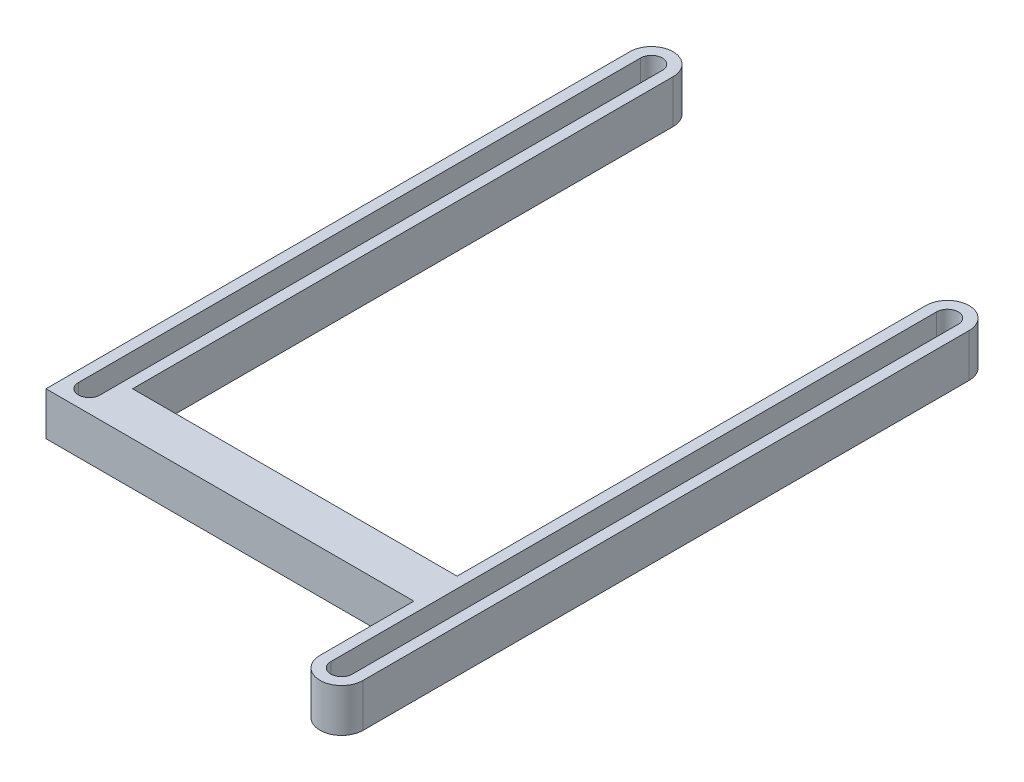
ISO-10303-21;
HEADER;
FILE_DESCRIPTION(('STEP AP214'),'2;1');
FILE_NAME('part.step','',(''),(''),'','','');
FILE_SCHEMA(('AUTOMOTIVE_DESIGN { 1 0 10303 214 1 1 1 1 }'));
ENDSEC;
DATA;
#1=APPLICATION_CONTEXT('core data for automotive mechanical design processes');
#2=APPLICATION_PROTOCOL_DEFINITION('international standard','automotive_design',2000,#1);
#3=PRODUCT_CONTEXT('',#1,'mechanical');
#4=PRODUCT('Part','Part','',(#3));
#5=PRODUCT_RELATED_PRODUCT_CATEGORY('part','',(#4));
#6=PRODUCT_DEFINITION_FORMATION('','',#4);
#7=PRODUCT_DEFINITION_CONTEXT('part definition',#1,'design');
#8=PRODUCT_DEFINITION('design','',#6,#7);
#9=PRODUCT_DEFINITION_SHAPE('','',#8);
#10=(LENGTH_UNIT() NAMED_UNIT(*) SI_UNIT(.MILLI.,.METRE.));
#11=(NAMED_UNIT(*) PLANE_ANGLE_UNIT() SI_UNIT($,.RADIAN.));
#12=(NAMED_UNIT(*) SI_UNIT($,.STERADIAN.) SOLID_ANGLE_UNIT());
#13=UNCERTAINTY_MEASURE_WITH_UNIT(LENGTH_MEASURE(1.E-05),#10,'distance_accuracy_value','');
#14=(GEOMETRIC_REPRESENTATION_CONTEXT(3) GLOBAL_UNCERTAINTY_ASSIGNED_CONTEXT((#13)) GLOBAL_UNIT_ASSIGNED_CONTEXT((#10,
#11,#12)) REPRESENTATION_CONTEXT('',''));
#15=CARTESIAN_POINT('',(0.,0.,0.));
#16=DIRECTION('',(0.,0.,1.));
#17=DIRECTION('',(1.,0.,0.));
#18=AXIS2_PLACEMENT_3D('',#15,#16,#17);
#19=CARTESIAN_POINT('',(245.,-20.,0.));
#20=DIRECTION('',(1.,0.,0.));
#21=DIRECTION('',(0.,0.,-1.));
#22=AXIS2_PLACEMENT_3D('',#19,#20,#21);
#23=PLANE('',#22);
#24=DIRECTION('',(0.,0.,-1.));
#25=VECTOR('',#24,1.);
#26=CARTESIAN_POINT('',(245.,-10.,0.));
#27=LINE('',#26,#25);
#28=CARTESIAN_POINT('',(245.,-10.,567.916512459885));
#29=VERTEX_POINT('',#28);
#30=CARTESIAN_POINT('',(245.,-10.,433.01270189222));
#31=VERTEX_POINT('',#30);
#32=EDGE_CURVE('E221',#29,#31,#27,.T.);
#33=ORIENTED_EDGE('',*,*,#32,.T.);
#34=DIRECTION('',(0.,1.,0.));
#35=VECTOR('',#34,1.);
#36=CARTESIAN_POINT('',(245.,-20.,433.01270189222));
#37=LINE('',#36,#35);
#38=CARTESIAN_POINT('',(245.,-20.,433.01270189222));
#39=VERTEX_POINT('',#38);
#40=EDGE_CURVE('E11',#39,#31,#37,.T.);
#41=ORIENTED_EDGE('',*,*,#40,.F.);
#42=DIRECTION('',(0.,0.,-1.));
#43=VECTOR('',#42,1.);
#44=CARTESIAN_POINT('',(245.,-20.,0.));
#45=LINE('',#44,#43);
#46=CARTESIAN_POINT('',(245.,-20.,567.916512459885));
#47=VERTEX_POINT('',#46);
#48=EDGE_CURVE('E385',#47,#39,#45,.T.);
#49=ORIENTED_EDGE('',*,*,#48,.F.);
#50=DIRECTION('',(0.,1.,0.));
#51=VECTOR('',#50,1.);
#52=CARTESIAN_POINT('',(245.,-20.,567.916512459885));
#53=LINE('',#52,#51);
#54=EDGE_CURVE('E245',#47,#29,#53,.T.);
#55=ORIENTED_EDGE('',*,*,#54,.T.);
#56=EDGE_LOOP('',(#33,#41,#49,#55));
#57=FACE_BOUND('',#56,.T.);
#58=ADVANCED_FACE('F35',(#57),#23,.F.);
#59=CARTESIAN_POINT('',(250.,-20.,433.01270189222));
#60=DIRECTION('',(0.,1.,0.));
#61=DIRECTION('',(0.,0.,1.));
#62=AXIS2_PLACEMENT_3D('',#59,#60,#61);
#63=CYLINDRICAL_SURFACE('',#62,5.);
#64=CARTESIAN_POINT('',(250.,-10.,433.01270189222));
#65=DIRECTION('',(0.,-1.,0.));
#66=DIRECTION('',(0.,0.,-1.));
#67=AXIS2_PLACEMENT_3D('',#64,#65,#66);
#68=CIRCLE('',#67,5.);
#69=CARTESIAN_POINT('',(255.,-10.,433.01270189222));
#70=VERTEX_POINT('',#69);
#71=EDGE_CURVE('E224',#31,#70,#68,.T.);
#72=ORIENTED_EDGE('',*,*,#71,.T.);
#73=DIRECTION('',(0.,1.,0.));
#74=VECTOR('',#73,1.);
#75=CARTESIAN_POINT('',(255.,-20.,433.01270189222));
#76=LINE('',#75,#74);
#77=CARTESIAN_POINT('',(255.,-20.,433.01270189222));
#78=VERTEX_POINT('',#77);
#79=EDGE_CURVE('E45',#78,#70,#76,.T.);
#80=ORIENTED_EDGE('',*,*,#79,.F.);
#81=CARTESIAN_POINT('',(250.,-20.,433.01270189222));
#82=DIRECTION('',(0.,-1.,0.));
#83=DIRECTION('',(0.,0.,-1.));
#84=AXIS2_PLACEMENT_3D('',#81,#82,#83);
#85=CIRCLE('',#84,5.);
#86=EDGE_CURVE('E376',#39,#78,#85,.T.);
#87=ORIENTED_EDGE('',*,*,#86,.F.);
#88=ORIENTED_EDGE('',*,*,#40,.T.);
#89=EDGE_LOOP('',(#72,#80,#87,#88));
#90=FACE_BOUND('',#89,.T.);
#91=ADVANCED_FACE('F301',(#90),#63,.T.);
#92=CARTESIAN_POINT('',(255.,-20.,0.));
#93=DIRECTION('',(1.,0.,0.));
#94=DIRECTION('',(0.,0.,-1.));
#95=AXIS2_PLACEMENT_3D('',#92,#93,#94);
#96=PLANE('',#95);
#97=DIRECTION('',(0.,0.,-1.));
#98=VECTOR('',#97,1.);
#99=CARTESIAN_POINT('',(255.,-10.,0.));
#100=LINE('',#99,#98);
#101=CARTESIAN_POINT('',(255.,-10.,557.916512459885));
#102=VERTEX_POINT('',#101);
#103=EDGE_CURVE('E227',#102,#70,#100,.T.);
#104=ORIENTED_EDGE('',*,*,#103,.F.);
#105=DIRECTION('',(0.,1.,0.));
#106=VECTOR('',#105,1.);
#107=CARTESIAN_POINT('',(255.,-20.,557.916512459885));
#108=LINE('',#107,#106);
#109=CARTESIAN_POINT('',(255.,-20.,557.916512459885));
#110=VERTEX_POINT('',#109);
#111=EDGE_CURVE('E257',#110,#102,#108,.T.);
#112=ORIENTED_EDGE('',*,*,#111,.F.);
#113=DIRECTION('',(0.,0.,-1.));
#114=VECTOR('',#113,1.);
#115=CARTESIAN_POINT('',(255.,-20.,0.));
#116=LINE('',#115,#114);
#117=EDGE_CURVE('E373',#110,#78,#116,.T.);
#118=ORIENTED_EDGE('',*,*,#117,.T.);
#119=ORIENTED_EDGE('',*,*,#79,.T.);
#120=EDGE_LOOP('',(#104,#112,#118,#119));
#121=FACE_BOUND('',#120,.T.);
#122=ADVANCED_FACE('F307',(#121),#96,.T.);
#123=CARTESIAN_POINT('',(0.,-20.,557.916512459885));
#124=DIRECTION('',(0.,0.,-1.));
#125=DIRECTION('',(-1.,0.,0.));
#126=AXIS2_PLACEMENT_3D('',#123,#124,#125);
#127=PLANE('',#126);
#128=DIRECTION('',(-1.,0.,0.));
#129=VECTOR('',#128,1.);
#130=CARTESIAN_POINT('',(0.,-10.,557.916512459885));
#131=LINE('',#130,#129);
#132=CARTESIAN_POINT('',(330.,-10.,557.916512459885));
#133=VERTEX_POINT('',#132);
#134=EDGE_CURVE('E230',#133,#102,#131,.T.);
#135=ORIENTED_EDGE('',*,*,#134,.F.);
#136=DIRECTION('',(0.,1.,0.));
#137=VECTOR('',#136,1.);
#138=CARTESIAN_POINT('',(330.,-20.,557.916512459885));
#139=LINE('',#138,#137);
#140=CARTESIAN_POINT('',(330.,-20.,557.916512459885));
#141=VERTEX_POINT('',#140);
#142=EDGE_CURVE('E255',#141,#133,#139,.T.);
#143=ORIENTED_EDGE('',*,*,#142,.F.);
#144=DIRECTION('',(-1.,0.,0.));
#145=VECTOR('',#144,1.);
#146=CARTESIAN_POINT('',(0.,-20.,557.916512459885));
#147=LINE('',#146,#145);
#148=EDGE_CURVE('E371',#141,#110,#147,.T.);
#149=ORIENTED_EDGE('',*,*,#148,.T.);
#150=ORIENTED_EDGE('',*,*,#111,.T.);
#151=EDGE_LOOP('',(#135,#143,#149,#150));
#152=FACE_BOUND('',#151,.T.);
#153=ADVANCED_FACE('F351',(#152),#127,.T.);
#154=CARTESIAN_POINT('',(330.,-20.,0.));
#155=DIRECTION('',(1.,0.,0.));
#156=DIRECTION('',(0.,0.,-1.));
#157=AXIS2_PLACEMENT_3D('',#154,#155,#156);
#158=PLANE('',#157);
#159=DIRECTION('',(0.,0.,-1.));
#160=VECTOR('',#159,1.);
#161=CARTESIAN_POINT('',(330.,-10.,0.));
#162=LINE('',#161,#160);
#163=CARTESIAN_POINT('',(330.,-10.,449.615242270663));
#164=VERTEX_POINT('',#163);
#165=EDGE_CURVE('E233',#133,#164,#162,.T.);
#166=ORIENTED_EDGE('',*,*,#165,.T.);
#167=DIRECTION('',(0.,1.,0.));
#168=VECTOR('',#167,1.);
#169=CARTESIAN_POINT('',(330.,-20.,449.615242270663));
#170=LINE('',#169,#168);
#171=CARTESIAN_POINT('',(330.,-20.,449.615242270663));
#172=VERTEX_POINT('',#171);
#173=EDGE_CURVE('E252',#172,#164,#170,.T.);
#174=ORIENTED_EDGE('',*,*,#173,.F.);
#175=DIRECTION('',(0.,0.,-1.));
#176=VECTOR('',#175,1.);
#177=CARTESIAN_POINT('',(330.,-20.,0.));
#178=LINE('',#177,#176);
#179=EDGE_CURVE('E372',#141,#172,#178,.T.);
#180=ORIENTED_EDGE('',*,*,#179,.F.);
#181=ORIENTED_EDGE('',*,*,#142,.T.);
#182=EDGE_LOOP('',(#166,#174,#180,#181));
#183=FACE_BOUND('',#182,.T.);
#184=ADVANCED_FACE('F347',(#183),#158,.F.);
#185=CARTESIAN_POINT('',(335.,-20.,449.615242270663));
#186=DIRECTION('',(0.,1.,0.));
#187=DIRECTION('',(0.,0.,1.));
#188=AXIS2_PLACEMENT_3D('',#185,#186,#187);
#189=CYLINDRICAL_SURFACE('',#188,5.);
#190=CARTESIAN_POINT('',(335.,-10.,449.615242270663));
#191=DIRECTION('',(0.,-1.,0.));
#192=DIRECTION('',(0.,0.,-1.));
#193=AXIS2_PLACEMENT_3D('',#190,#191,#192);
#194=CIRCLE('',#193,5.);
#195=CARTESIAN_POINT('',(340.,-10.,449.615242270663));
#196=VERTEX_POINT('',#195);
#197=EDGE_CURVE('E235',#164,#196,#194,.T.);
#198=ORIENTED_EDGE('',*,*,#197,.T.);
#199=DIRECTION('',(0.,1.,0.));
#200=VECTOR('',#199,1.);
#201=CARTESIAN_POINT('',(340.,-20.,449.615242270663));
#202=LINE('',#201,#200);
#203=CARTESIAN_POINT('',(340.,-20.,449.615242270663));
#204=VERTEX_POINT('',#203);
#205=EDGE_CURVE('E250',#204,#196,#202,.T.);
#206=ORIENTED_EDGE('',*,*,#205,.F.);
#207=CARTESIAN_POINT('',(335.,-20.,449.615242270663));
#208=DIRECTION('',(0.,-1.,0.));
#209=DIRECTION('',(0.,0.,-1.));
#210=AXIS2_PLACEMENT_3D('',#207,#208,#209);
#211=CIRCLE('',#210,5.);
#212=EDGE_CURVE('E191',#172,#204,#211,.T.);
#213=ORIENTED_EDGE('',*,*,#212,.F.);
#214=ORIENTED_EDGE('',*,*,#173,.T.);
#215=EDGE_LOOP('',(#198,#206,#213,#214));
#216=FACE_BOUND('',#215,.T.);
#217=ADVANCED_FACE('F343',(#216),#189,.T.);
#218=CARTESIAN_POINT('',(340.,-20.,0.));
#219=DIRECTION('',(1.,0.,0.));
#220=DIRECTION('',(0.,0.,-1.));
#221=AXIS2_PLACEMENT_3D('',#218,#219,#220);
#222=PLANE('',#221);
#223=DIRECTION('',(0.,0.,-1.));
#224=VECTOR('',#223,1.);
#225=CARTESIAN_POINT('',(340.,-10.,0.));
#226=LINE('',#225,#224);
#227=CARTESIAN_POINT('',(340.,-10.,589.615242270663));
#228=VERTEX_POINT('',#227);
#229=EDGE_CURVE('E238',#228,#196,#226,.T.);
#230=ORIENTED_EDGE('',*,*,#229,.F.);
#231=DIRECTION('',(0.,1.,0.));
#232=VECTOR('',#231,1.);
#233=CARTESIAN_POINT('',(340.,-20.,589.615242270663));
#234=LINE('',#233,#232);
#235=CARTESIAN_POINT('',(340.,-20.,589.615242270663));
#236=VERTEX_POINT('',#235);
#237=EDGE_CURVE('E180',#236,#228,#234,.T.);
#238=ORIENTED_EDGE('',*,*,#237,.F.);
#239=DIRECTION('',(0.,0.,-1.));
#240=VECTOR('',#239,1.);
#241=CARTESIAN_POINT('',(340.,-20.,0.));
#242=LINE('',#241,#240);
#243=EDGE_CURVE('E189',#236,#204,#242,.T.);
#244=ORIENTED_EDGE('',*,*,#243,.T.);
#245=ORIENTED_EDGE('',*,*,#205,.T.);
#246=EDGE_LOOP('',(#230,#238,#244,#245));
#247=FACE_BOUND('',#246,.T.);
#248=ADVANCED_FACE('F340',(#247),#222,.T.);
#249=CARTESIAN_POINT('',(335.,-20.,589.615242270663));
#250=DIRECTION('',(0.,1.,0.));
#251=DIRECTION('',(0.,0.,1.));
#252=AXIS2_PLACEMENT_3D('',#249,#250,#251);
#253=CYLINDRICAL_SURFACE('',#252,5.);
#254=CARTESIAN_POINT('',(335.,-10.,589.615242270663));
#255=DIRECTION('',(0.,-1.,0.));
#256=DIRECTION('',(0.,0.,-1.));
#257=AXIS2_PLACEMENT_3D('',#254,#255,#256);
#258=CIRCLE('',#257,5.);
#259=CARTESIAN_POINT('',(330.,-10.,589.615242270663));
#260=VERTEX_POINT('',#259);
#261=EDGE_CURVE('E179',#260,#228,#258,.F.);
#262=ORIENTED_EDGE('',*,*,#261,.F.);
#263=DIRECTION('',(0.,1.,0.));
#264=VECTOR('',#263,1.);
#265=CARTESIAN_POINT('',(330.,-20.,589.615242270663));
#266=LINE('',#265,#264);
#267=CARTESIAN_POINT('',(330.,-20.,589.615242270663));
#268=VERTEX_POINT('',#267);
#269=EDGE_CURVE('E173',#268,#260,#266,.T.);
#270=ORIENTED_EDGE('',*,*,#269,.F.);
#271=CARTESIAN_POINT('',(335.,-20.,589.615242270663));
#272=DIRECTION('',(0.,-1.,0.));
#273=DIRECTION('',(0.,0.,-1.));
#274=AXIS2_PLACEMENT_3D('',#271,#272,#273);
#275=CIRCLE('',#274,5.);
#276=EDGE_CURVE('E177',#268,#236,#275,.F.);
#277=ORIENTED_EDGE('',*,*,#276,.T.);
#278=ORIENTED_EDGE('',*,*,#237,.T.);
#279=EDGE_LOOP('',(#262,#270,#277,#278));
#280=FACE_BOUND('',#279,.T.);
#281=ADVANCED_FACE('F175',(#280),#253,.T.);
#282=CARTESIAN_POINT('',(330.,-20.,0.));
#283=DIRECTION('',(1.,0.,0.));
#284=DIRECTION('',(0.,0.,-1.));
#285=AXIS2_PLACEMENT_3D('',#282,#283,#284);
#286=PLANE('',#285);
#287=DIRECTION('',(0.,0.,-1.));
#288=VECTOR('',#287,1.);
#289=CARTESIAN_POINT('',(330.,-10.,0.));
#290=LINE('',#289,#288);
#291=CARTESIAN_POINT('',(330.,-10.,567.916512459885));
#292=VERTEX_POINT('',#291);
#293=EDGE_CURVE('E112',#260,#292,#290,.T.);
#294=ORIENTED_EDGE('',*,*,#293,.T.);
#295=DIRECTION('',(0.,1.,0.));
#296=VECTOR('',#295,1.);
#297=CARTESIAN_POINT('',(330.,-20.,567.916512459885));
#298=LINE('',#297,#296);
#299=CARTESIAN_POINT('',(330.,-20.,567.916512459885));
#300=VERTEX_POINT('',#299);
#301=EDGE_CURVE('E181',#300,#292,#298,.T.);
#302=ORIENTED_EDGE('',*,*,#301,.F.);
#303=DIRECTION('',(0.,0.,-1.));
#304=VECTOR('',#303,1.);
#305=CARTESIAN_POINT('',(330.,-20.,0.));
#306=LINE('',#305,#304);
#307=EDGE_CURVE('E183',#268,#300,#306,.T.);
#308=ORIENTED_EDGE('',*,*,#307,.F.);
#309=ORIENTED_EDGE('',*,*,#269,.T.);
#310=EDGE_LOOP('',(#294,#302,#308,#309));
#311=FACE_BOUND('',#310,.T.);
#312=ADVANCED_FACE('F184',(#311),#286,.F.);
#313=CARTESIAN_POINT('',(250.,-20.,433.01270189222));
#314=DIRECTION('',(0.,1.,0.));
#315=DIRECTION('',(0.,0.,1.));
#316=AXIS2_PLACEMENT_3D('',#313,#314,#315);
#317=CYLINDRICAL_SURFACE('',#316,2.5);
#318=CARTESIAN_POINT('',(250.,-10.,433.01270189222));
#319=DIRECTION('',(0.,-1.,0.));
#320=DIRECTION('',(0.,0.,-1.));
#321=AXIS2_PLACEMENT_3D('',#318,#319,#320);
#322=CIRCLE('',#321,2.5);
#323=CARTESIAN_POINT('',(247.5,-10.,433.01270189222));
#324=VERTEX_POINT('',#323);
#325=CARTESIAN_POINT('',(252.5,-10.,433.01270189222));
#326=VERTEX_POINT('',#325);
#327=EDGE_CURVE('E209',#324,#326,#322,.T.);
#328=ORIENTED_EDGE('',*,*,#327,.F.);
#329=DIRECTION('',(0.,1.,0.));
#330=VECTOR('',#329,1.);
#331=CARTESIAN_POINT('',(247.5,-20.,433.01270189222));
#332=LINE('',#331,#330);
#333=CARTESIAN_POINT('',(247.5,-20.,433.01270189222));
#334=VERTEX_POINT('',#333);
#335=EDGE_CURVE('E247',#334,#324,#332,.T.);
#336=ORIENTED_EDGE('',*,*,#335,.F.);
#337=CARTESIAN_POINT('',(250.,-20.,433.01270189222));
#338=DIRECTION('',(0.,-1.,0.));
#339=DIRECTION('',(0.,0.,-1.));
#340=AXIS2_PLACEMENT_3D('',#337,#338,#339);
#341=CIRCLE('',#340,2.5);
#342=CARTESIAN_POINT('',(252.5,-20.,433.01270189222));
#343=VERTEX_POINT('',#342);
#344=EDGE_CURVE('E396',#334,#343,#341,.T.);
#345=ORIENTED_EDGE('',*,*,#344,.T.);
#346=DIRECTION('',(0.,1.,0.));
#347=VECTOR('',#346,1.);
#348=CARTESIAN_POINT('',(252.5,-20.,433.01270189222));
#349=LINE('',#348,#347);
#350=EDGE_CURVE('E260',#343,#326,#349,.T.);
#351=ORIENTED_EDGE('',*,*,#350,.T.);
#352=EDGE_LOOP('',(#328,#336,#345,#351));
#353=FACE_BOUND('',#352,.T.);
#354=ADVANCED_FACE('F319',(#353),#317,.F.);
#355=CARTESIAN_POINT('',(247.5,-20.,0.));
#356=DIRECTION('',(1.,0.,0.));
#357=DIRECTION('',(0.,0.,-1.));
#358=AXIS2_PLACEMENT_3D('',#355,#356,#357);
#359=PLANE('',#358);
#360=DIRECTION('',(0.,0.,-1.));
#361=VECTOR('',#360,1.);
#362=CARTESIAN_POINT('',(247.5,-10.,0.));
#363=LINE('',#362,#361);
#364=CARTESIAN_POINT('',(247.5,-10.,562.916512459885));
#365=VERTEX_POINT('',#364);
#366=EDGE_CURVE('E212',#365,#324,#363,.T.);
#367=ORIENTED_EDGE('',*,*,#366,.F.);
#368=DIRECTION('',(0.,1.,0.));
#369=VECTOR('',#368,1.);
#370=CARTESIAN_POINT('',(247.5,-20.,562.916512459885));
#371=LINE('',#370,#369);
#372=CARTESIAN_POINT('',(247.5,-20.,562.916512459885));
#373=VERTEX_POINT('',#372);
#374=EDGE_CURVE('E265',#373,#365,#371,.T.);
#375=ORIENTED_EDGE('',*,*,#374,.F.);
#376=DIRECTION('',(0.,0.,-1.));
#377=VECTOR('',#376,1.);
#378=CARTESIAN_POINT('',(247.5,-20.,0.));
#379=LINE('',#378,#377);
#380=EDGE_CURVE('E393',#373,#334,#379,.T.);
#381=ORIENTED_EDGE('',*,*,#380,.T.);
#382=ORIENTED_EDGE('',*,*,#335,.T.);
#383=EDGE_LOOP('',(#367,#375,#381,#382));
#384=FACE_BOUND('',#383,.T.);
#385=ADVANCED_FACE('F315',(#384),#359,.T.);
#386=CARTESIAN_POINT('',(250.,-20.,562.916512459885));
#387=DIRECTION('',(0.,1.,0.));
#388=DIRECTION('',(0.,0.,1.));
#389=AXIS2_PLACEMENT_3D('',#386,#387,#388);
#390=CYLINDRICAL_SURFACE('',#389,2.5);
#391=CARTESIAN_POINT('',(250.,-10.,562.916512459885));
#392=DIRECTION('',(0.,-1.,0.));
#393=DIRECTION('',(0.,0.,-1.));
#394=AXIS2_PLACEMENT_3D('',#391,#392,#393);
#395=CIRCLE('',#394,2.5);
#396=CARTESIAN_POINT('',(252.5,-10.,562.916512459885));
#397=VERTEX_POINT('',#396);
#398=EDGE_CURVE('E215',#365,#397,#395,.F.);
#399=ORIENTED_EDGE('',*,*,#398,.T.);
#400=DIRECTION('',(0.,1.,0.));
#401=VECTOR('',#400,1.);
#402=CARTESIAN_POINT('',(252.5,-20.,562.916512459885));
#403=LINE('',#402,#401);
#404=CARTESIAN_POINT('',(252.5,-20.,562.916512459885));
#405=VERTEX_POINT('',#404);
#406=EDGE_CURVE('E262',#405,#397,#403,.T.);
#407=ORIENTED_EDGE('',*,*,#406,.F.);
#408=CARTESIAN_POINT('',(250.,-20.,562.916512459885));
#409=DIRECTION('',(0.,-1.,0.));
#410=DIRECTION('',(0.,0.,-1.));
#411=AXIS2_PLACEMENT_3D('',#408,#409,#410);
#412=CIRCLE('',#411,2.5);
#413=EDGE_CURVE('E388',#373,#405,#412,.F.);
#414=ORIENTED_EDGE('',*,*,#413,.F.);
#415=ORIENTED_EDGE('',*,*,#374,.T.);
#416=EDGE_LOOP('',(#399,#407,#414,#415));
#417=FACE_BOUND('',#416,.T.);
#418=ADVANCED_FACE('F312',(#417),#390,.F.);
#419=CARTESIAN_POINT('',(335.,-20.,589.615242270663));
#420=DIRECTION('',(0.,1.,0.));
#421=DIRECTION('',(0.,0.,1.));
#422=AXIS2_PLACEMENT_3D('',#419,#420,#421);
#423=CYLINDRICAL_SURFACE('',#422,2.49999999999995);
#424=CARTESIAN_POINT('',(335.,-10.,589.615242270663));
#425=DIRECTION('',(0.,-1.,0.));
#426=DIRECTION('',(0.,0.,-1.));
#427=AXIS2_PLACEMENT_3D('',#424,#425,#426);
#428=CIRCLE('',#427,2.49999999999995);
#429=CARTESIAN_POINT('',(332.5,-10.,589.615242270663));
#430=VERTEX_POINT('',#429);
#431=CARTESIAN_POINT('',(337.5,-10.,589.615242270663));
#432=VERTEX_POINT('',#431);
#433=EDGE_CURVE('E197',#430,#432,#428,.F.);
#434=ORIENTED_EDGE('',*,*,#433,.T.);
#435=DIRECTION('',(0.,1.,0.));
#436=VECTOR('',#435,1.);
#437=CARTESIAN_POINT('',(337.5,-20.,589.615242270663));
#438=LINE('',#437,#436);
#439=CARTESIAN_POINT('',(337.5,-20.,589.615242270663));
#440=VERTEX_POINT('',#439);
#441=EDGE_CURVE('E39',#440,#432,#438,.T.);
#442=ORIENTED_EDGE('',*,*,#441,.F.);
#443=CARTESIAN_POINT('',(335.,-20.,589.615242270663));
#444=DIRECTION('',(0.,-1.,0.));
#445=DIRECTION('',(0.,0.,-1.));
#446=AXIS2_PLACEMENT_3D('',#443,#444,#445);
#447=CIRCLE('',#446,2.49999999999995);
#448=CARTESIAN_POINT('',(332.5,-20.,589.615242270663));
#449=VERTEX_POINT('',#448);
#450=EDGE_CURVE('E244',#449,#440,#447,.F.);
#451=ORIENTED_EDGE('',*,*,#450,.F.);
#452=DIRECTION('',(0.,1.,0.));
#453=VECTOR('',#452,1.);
#454=CARTESIAN_POINT('',(332.5,-20.,589.615242270663));
#455=LINE('',#454,#453);
#456=EDGE_CURVE('E196',#449,#430,#455,.T.);
#457=ORIENTED_EDGE('',*,*,#456,.T.);
#458=EDGE_LOOP('',(#434,#442,#451,#457));
#459=FACE_BOUND('',#458,.T.);
#460=ADVANCED_FACE('F37',(#459),#423,.F.);
#461=CARTESIAN_POINT('',(337.5,-20.,0.));
#462=DIRECTION('',(1.,0.,0.));
#463=DIRECTION('',(0.,0.,-1.));
#464=AXIS2_PLACEMENT_3D('',#461,#462,#463);
#465=PLANE('',#464);
#466=DIRECTION('',(0.,0.,-1.));
#467=VECTOR('',#466,1.);
#468=CARTESIAN_POINT('',(337.5,-10.,0.));
#469=LINE('',#468,#467);
#470=CARTESIAN_POINT('',(337.5,-10.,449.615242270663));
#471=VERTEX_POINT('',#470);
#472=EDGE_CURVE('E200',#432,#471,#469,.T.);
#473=ORIENTED_EDGE('',*,*,#472,.T.);
#474=DIRECTION('',(0.,1.,0.));
#475=VECTOR('',#474,1.);
#476=CARTESIAN_POINT('',(337.5,-20.,449.615242270663));
#477=LINE('',#476,#475);
#478=CARTESIAN_POINT('',(337.5,-20.,449.615242270663));
#479=VERTEX_POINT('',#478);
#480=EDGE_CURVE('E270',#479,#471,#477,.T.);
#481=ORIENTED_EDGE('',*,*,#480,.F.);
#482=DIRECTION('',(0.,0.,-1.));
#483=VECTOR('',#482,1.);
#484=CARTESIAN_POINT('',(337.5,-20.,0.));
#485=LINE('',#484,#483);
#486=EDGE_CURVE('E127',#440,#479,#485,.T.);
#487=ORIENTED_EDGE('',*,*,#486,.F.);
#488=ORIENTED_EDGE('',*,*,#441,.T.);
#489=EDGE_LOOP('',(#473,#481,#487,#488));
#490=FACE_BOUND('',#489,.T.);
#491=ADVANCED_FACE('F275',(#490),#465,.F.);
#492=CARTESIAN_POINT('',(335.,-20.,449.615242270663));
#493=DIRECTION('',(0.,1.,0.));
#494=DIRECTION('',(0.,0.,1.));
#495=AXIS2_PLACEMENT_3D('',#492,#493,#494);
#496=CYLINDRICAL_SURFACE('',#495,2.5);
#497=CARTESIAN_POINT('',(335.,-10.,449.615242270663));
#498=DIRECTION('',(0.,-1.,0.));
#499=DIRECTION('',(0.,0.,-1.));
#500=AXIS2_PLACEMENT_3D('',#497,#498,#499);
#501=CIRCLE('',#500,2.5);
#502=CARTESIAN_POINT('',(332.5,-10.,449.615242270663));
#503=VERTEX_POINT('',#502);
#504=EDGE_CURVE('E203',#503,#471,#501,.T.);
#505=ORIENTED_EDGE('',*,*,#504,.F.);
#506=DIRECTION('',(0.,1.,0.));
#507=VECTOR('',#506,1.);
#508=CARTESIAN_POINT('',(332.5,-20.,449.615242270663));
#509=LINE('',#508,#507);
#510=CARTESIAN_POINT('',(332.5,-20.,449.615242270663));
#511=VERTEX_POINT('',#510);
#512=EDGE_CURVE('E269',#511,#503,#509,.T.);
#513=ORIENTED_EDGE('',*,*,#512,.F.);
#514=CARTESIAN_POINT('',(335.,-20.,449.615242270663));
#515=DIRECTION('',(0.,-1.,0.));
#516=DIRECTION('',(0.,0.,-1.));
#517=AXIS2_PLACEMENT_3D('',#514,#515,#516);
#518=CIRCLE('',#517,2.5);
#519=EDGE_CURVE('E400',#511,#479,#518,.T.);
#520=ORIENTED_EDGE('',*,*,#519,.T.);
#521=ORIENTED_EDGE('',*,*,#480,.T.);
#522=EDGE_LOOP('',(#505,#513,#520,#521));
#523=FACE_BOUND('',#522,.T.);
#524=ADVANCED_FACE('F289',(#523),#496,.F.);
#525=CARTESIAN_POINT('',(252.5,-20.,0.));
#526=DIRECTION('',(1.,0.,0.));
#527=DIRECTION('',(0.,0.,-1.));
#528=AXIS2_PLACEMENT_3D('',#525,#526,#527);
#529=PLANE('',#528);
#530=DIRECTION('',(0.,0.,-1.));
#531=VECTOR('',#530,1.);
#532=CARTESIAN_POINT('',(252.5,-10.,0.));
#533=LINE('',#532,#531);
#534=EDGE_CURVE('E218',#397,#326,#533,.T.);
#535=ORIENTED_EDGE('',*,*,#534,.T.);
#536=ORIENTED_EDGE('',*,*,#350,.F.);
#537=DIRECTION('',(0.,0.,-1.));
#538=VECTOR('',#537,1.);
#539=CARTESIAN_POINT('',(252.5,-20.,0.));
#540=LINE('',#539,#538);
#541=EDGE_CURVE('E386',#405,#343,#540,.T.);
#542=ORIENTED_EDGE('',*,*,#541,.F.);
#543=ORIENTED_EDGE('',*,*,#406,.T.);
#544=EDGE_LOOP('',(#535,#536,#542,#543));
#545=FACE_BOUND('',#544,.T.);
#546=ADVANCED_FACE('F291',(#545),#529,.F.);
#547=CARTESIAN_POINT('',(332.5,-20.,0.));
#548=DIRECTION('',(1.,0.,0.));
#549=DIRECTION('',(0.,0.,-1.));
#550=AXIS2_PLACEMENT_3D('',#547,#548,#549);
#551=PLANE('',#550);
#552=DIRECTION('',(0.,0.,-1.));
#553=VECTOR('',#552,1.);
#554=CARTESIAN_POINT('',(332.5,-10.,0.));
#555=LINE('',#554,#553);
#556=EDGE_CURVE('E206',#430,#503,#555,.T.);
#557=ORIENTED_EDGE('',*,*,#556,.F.);
#558=ORIENTED_EDGE('',*,*,#456,.F.);
#559=DIRECTION('',(0.,0.,-1.));
#560=VECTOR('',#559,1.);
#561=CARTESIAN_POINT('',(332.5,-20.,0.));
#562=LINE('',#561,#560);
#563=EDGE_CURVE('E287',#449,#511,#562,.T.);
#564=ORIENTED_EDGE('',*,*,#563,.T.);
#565=ORIENTED_EDGE('',*,*,#512,.T.);
#566=EDGE_LOOP('',(#557,#558,#564,#565));
#567=FACE_BOUND('',#566,.T.);
#568=ADVANCED_FACE('F284',(#567),#551,.T.);
#569=CARTESIAN_POINT('',(0.,-20.,567.916512459885));
#570=DIRECTION('',(0.,0.,-1.));
#571=DIRECTION('',(-1.,0.,0.));
#572=AXIS2_PLACEMENT_3D('',#569,#570,#571);
#573=PLANE('',#572);
#574=DIRECTION('',(-1.,0.,0.));
#575=VECTOR('',#574,1.);
#576=CARTESIAN_POINT('',(0.,-10.,567.916512459885));
#577=LINE('',#576,#575);
#578=EDGE_CURVE('E118',#292,#29,#577,.T.);
#579=ORIENTED_EDGE('',*,*,#578,.T.);
#580=ORIENTED_EDGE('',*,*,#54,.F.);
#581=DIRECTION('',(-1.,0.,0.));
#582=VECTOR('',#581,1.);
#583=CARTESIAN_POINT('',(0.,-20.,567.916512459885));
#584=LINE('',#583,#582);
#585=EDGE_CURVE('E54',#300,#47,#584,.T.);
#586=ORIENTED_EDGE('',*,*,#585,.F.);
#587=ORIENTED_EDGE('',*,*,#301,.T.);
#588=EDGE_LOOP('',(#579,#580,#586,#587));
#589=FACE_BOUND('',#588,.T.);
#590=ADVANCED_FACE('F324',(#589),#573,.F.);
#591=CARTESIAN_POINT('',(0.,-20.,0.));
#592=DIRECTION('',(0.,-1.,0.));
#593=DIRECTION('',(0.,0.,-1.));
#594=AXIS2_PLACEMENT_3D('',#591,#592,#593);
#595=PLANE('',#594);
#596=ORIENTED_EDGE('',*,*,#450,.T.);
#597=ORIENTED_EDGE('',*,*,#486,.T.);
#598=ORIENTED_EDGE('',*,*,#519,.F.);
#599=ORIENTED_EDGE('',*,*,#563,.F.);
#600=EDGE_LOOP('',(#596,#597,#598,#599));
#601=FACE_BOUND('',#600,.T.);
#602=ORIENTED_EDGE('',*,*,#344,.F.);
#603=ORIENTED_EDGE('',*,*,#380,.F.);
#604=ORIENTED_EDGE('',*,*,#413,.T.);
#605=ORIENTED_EDGE('',*,*,#541,.T.);
#606=EDGE_LOOP('',(#602,#603,#604,#605));
#607=FACE_BOUND('',#606,.T.);
#608=ORIENTED_EDGE('',*,*,#48,.T.);
#609=ORIENTED_EDGE('',*,*,#86,.T.);
#610=ORIENTED_EDGE('',*,*,#117,.F.);
#611=ORIENTED_EDGE('',*,*,#148,.F.);
#612=ORIENTED_EDGE('',*,*,#179,.T.);
#613=ORIENTED_EDGE('',*,*,#212,.T.);
#614=ORIENTED_EDGE('',*,*,#243,.F.);
#615=ORIENTED_EDGE('',*,*,#276,.F.);
#616=ORIENTED_EDGE('',*,*,#307,.T.);
#617=ORIENTED_EDGE('',*,*,#585,.T.);
#618=EDGE_LOOP('',(#608,#609,#610,#611,#612,#613,#614,#615,#616,#617));
#619=FACE_BOUND('',#618,.T.);
#620=ADVANCED_FACE('F187',(#601,#607,#619),#595,.T.);
#621=CARTESIAN_POINT('',(0.,-10.,0.));
#622=DIRECTION('',(0.,-1.,0.));
#623=DIRECTION('',(0.,0.,-1.));
#624=AXIS2_PLACEMENT_3D('',#621,#622,#623);
#625=PLANE('',#624);
#626=ORIENTED_EDGE('',*,*,#433,.F.);
#627=ORIENTED_EDGE('',*,*,#556,.T.);
#628=ORIENTED_EDGE('',*,*,#504,.T.);
#629=ORIENTED_EDGE('',*,*,#472,.F.);
#630=EDGE_LOOP('',(#626,#627,#628,#629));
#631=FACE_BOUND('',#630,.T.);
#632=ORIENTED_EDGE('',*,*,#327,.T.);
#633=ORIENTED_EDGE('',*,*,#534,.F.);
#634=ORIENTED_EDGE('',*,*,#398,.F.);
#635=ORIENTED_EDGE('',*,*,#366,.T.);
#636=EDGE_LOOP('',(#632,#633,#634,#635));
#637=FACE_BOUND('',#636,.T.);
#638=ORIENTED_EDGE('',*,*,#32,.F.);
#639=ORIENTED_EDGE('',*,*,#578,.F.);
#640=ORIENTED_EDGE('',*,*,#293,.F.);
#641=ORIENTED_EDGE('',*,*,#261,.T.);
#642=ORIENTED_EDGE('',*,*,#229,.T.);
#643=ORIENTED_EDGE('',*,*,#197,.F.);
#644=ORIENTED_EDGE('',*,*,#165,.F.);
#645=ORIENTED_EDGE('',*,*,#134,.T.);
#646=ORIENTED_EDGE('',*,*,#103,.T.);
#647=ORIENTED_EDGE('',*,*,#71,.F.);
#648=EDGE_LOOP('',(#638,#639,#640,#641,#642,#643,#644,#645,#646,#647));
#649=FACE_BOUND('',#648,.T.);
#650=ADVANCED_FACE('F281',(#631,#637,#649),#625,.F.);
#651=CLOSED_SHELL('',(#58,#91,#122,#153,#184,#217,#248,#281,#312,#354,#385,#418,#460,#491,#524,
#546,#568,#590,#620,#650));
#652=MANIFOLD_SOLID_BREP('B2',#651);
#653=ADVANCED_BREP_SHAPE_REPRESENTATION('',(#18,#652),#14);
#654=SHAPE_DEFINITION_REPRESENTATION(#9,#653);
ENDSEC;
END-ISO-10303-21;
